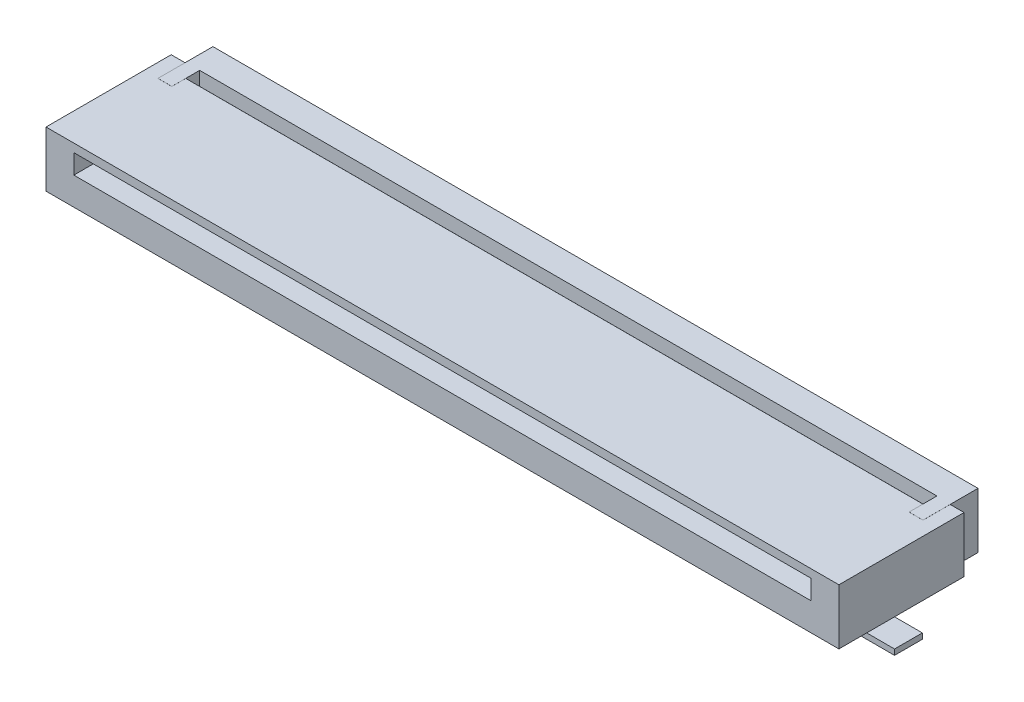
ISO-10303-21;
HEADER;
FILE_DESCRIPTION(('STEP AP214'),'2;1');
FILE_NAME('part.step','',(''),(''),'','','');
FILE_SCHEMA(('AUTOMOTIVE_DESIGN { 1 0 10303 214 1 1 1 1 }'));
ENDSEC;
DATA;
#1=APPLICATION_CONTEXT('core data for automotive mechanical design processes');
#2=APPLICATION_PROTOCOL_DEFINITION('international standard','automotive_design',2000,#1);
#3=PRODUCT_CONTEXT('',#1,'mechanical');
#4=PRODUCT('Part','Part','',(#3));
#5=PRODUCT_RELATED_PRODUCT_CATEGORY('part','',(#4));
#6=PRODUCT_DEFINITION_FORMATION('','',#4);
#7=PRODUCT_DEFINITION_CONTEXT('part definition',#1,'design');
#8=PRODUCT_DEFINITION('design','',#6,#7);
#9=PRODUCT_DEFINITION_SHAPE('','',#8);
#10=(LENGTH_UNIT() NAMED_UNIT(*) SI_UNIT(.MILLI.,.METRE.));
#11=(NAMED_UNIT(*) PLANE_ANGLE_UNIT() SI_UNIT($,.RADIAN.));
#12=(NAMED_UNIT(*) SI_UNIT($,.STERADIAN.) SOLID_ANGLE_UNIT());
#13=UNCERTAINTY_MEASURE_WITH_UNIT(LENGTH_MEASURE(1.E-05),#10,'distance_accuracy_value','');
#14=(GEOMETRIC_REPRESENTATION_CONTEXT(3) GLOBAL_UNCERTAINTY_ASSIGNED_CONTEXT((#13)) GLOBAL_UNIT_ASSIGNED_CONTEXT((#10,
#11,#12)) REPRESENTATION_CONTEXT('',''));
#15=CARTESIAN_POINT('',(0.,0.,0.));
#16=DIRECTION('',(0.,0.,1.));
#17=DIRECTION('',(1.,0.,0.));
#18=AXIS2_PLACEMENT_3D('',#15,#16,#17);
#19=CARTESIAN_POINT('',(14.25,2.,2.75));
#20=DIRECTION('',(-1.,0.,0.));
#21=DIRECTION('',(0.,0.,1.));
#22=AXIS2_PLACEMENT_3D('',#19,#20,#21);
#23=PLANE('',#22);
#24=DIRECTION('',(0.,0.,-1.));
#25=VECTOR('',#24,1.);
#26=CARTESIAN_POINT('',(14.25,1.998,-1.75));
#27=LINE('',#26,#25);
#28=CARTESIAN_POINT('',(14.25,1.998,2.75));
#29=VERTEX_POINT('',#28);
#30=CARTESIAN_POINT('',(14.25,1.998,-1.75));
#31=VERTEX_POINT('',#30);
#32=EDGE_CURVE('E299',#29,#31,#27,.T.);
#33=ORIENTED_EDGE('',*,*,#32,.F.);
#34=DIRECTION('',(0.,-1.,0.));
#35=VECTOR('',#34,1.);
#36=CARTESIAN_POINT('',(14.25,2.,2.75));
#37=LINE('',#36,#35);
#38=CARTESIAN_POINT('',(14.25,0.,2.75));
#39=VERTEX_POINT('',#38);
#40=EDGE_CURVE('E499',#29,#39,#37,.T.);
#41=ORIENTED_EDGE('',*,*,#40,.T.);
#42=DIRECTION('',(0.,0.,-1.));
#43=VECTOR('',#42,1.);
#44=CARTESIAN_POINT('',(14.25,0.,2.75));
#45=LINE('',#44,#43);
#46=CARTESIAN_POINT('',(14.25,0.,1.75));
#47=VERTEX_POINT('',#46);
#48=EDGE_CURVE('E501',#39,#47,#45,.T.);
#49=ORIENTED_EDGE('',*,*,#48,.T.);
#50=CARTESIAN_POINT('',(14.25,0.,0.749999999999999));
#51=VERTEX_POINT('',#50);
#52=EDGE_CURVE('E505',#47,#51,#45,.T.);
#53=ORIENTED_EDGE('',*,*,#52,.T.);
#54=CARTESIAN_POINT('',(14.25,0.,-1.75));
#55=VERTEX_POINT('',#54);
#56=EDGE_CURVE('E491',#51,#55,#45,.T.);
#57=ORIENTED_EDGE('',*,*,#56,.T.);
#58=DIRECTION('',(0.,1.,0.));
#59=VECTOR('',#58,1.);
#60=CARTESIAN_POINT('',(14.25,0.,-1.75));
#61=LINE('',#60,#59);
#62=EDGE_CURVE('E471',#55,#31,#61,.T.);
#63=ORIENTED_EDGE('',*,*,#62,.T.);
#64=EDGE_LOOP('',(#33,#41,#49,#53,#57,#63));
#65=FACE_BOUND('',#64,.T.);
#66=ADVANCED_FACE('F36',(#65),#23,.F.);
#67=CARTESIAN_POINT('',(-14.25,2.,2.75));
#68=DIRECTION('',(1.,0.,0.));
#69=DIRECTION('',(0.,0.,-1.));
#70=AXIS2_PLACEMENT_3D('',#67,#68,#69);
#71=PLANE('',#70);
#72=DIRECTION('',(0.,0.,1.));
#73=VECTOR('',#72,1.);
#74=CARTESIAN_POINT('',(-14.25,1.998,-1.75));
#75=LINE('',#74,#73);
#76=CARTESIAN_POINT('',(-14.25,1.998,-1.75));
#77=VERTEX_POINT('',#76);
#78=CARTESIAN_POINT('',(-14.25,1.998,2.75));
#79=VERTEX_POINT('',#78);
#80=EDGE_CURVE('E294',#77,#79,#75,.T.);
#81=ORIENTED_EDGE('',*,*,#80,.F.);
#82=DIRECTION('',(0.,1.,0.));
#83=VECTOR('',#82,1.);
#84=CARTESIAN_POINT('',(-14.25,0.,-1.75));
#85=LINE('',#84,#83);
#86=CARTESIAN_POINT('',(-14.25,0.,-1.75));
#87=VERTEX_POINT('',#86);
#88=EDGE_CURVE('E485',#87,#77,#85,.T.);
#89=ORIENTED_EDGE('',*,*,#88,.F.);
#90=DIRECTION('',(0.,0.,1.));
#91=VECTOR('',#90,1.);
#92=CARTESIAN_POINT('',(-14.25,0.,2.75));
#93=LINE('',#92,#91);
#94=CARTESIAN_POINT('',(-14.25,0.,0.749999999999999));
#95=VERTEX_POINT('',#94);
#96=EDGE_CURVE('E508',#87,#95,#93,.T.);
#97=ORIENTED_EDGE('',*,*,#96,.T.);
#98=CARTESIAN_POINT('',(-14.25,0.,1.75));
#99=VERTEX_POINT('',#98);
#100=EDGE_CURVE('E511',#95,#99,#93,.T.);
#101=ORIENTED_EDGE('',*,*,#100,.T.);
#102=CARTESIAN_POINT('',(-14.25,0.,2.75));
#103=VERTEX_POINT('',#102);
#104=EDGE_CURVE('E507',#99,#103,#93,.T.);
#105=ORIENTED_EDGE('',*,*,#104,.T.);
#106=DIRECTION('',(0.,-1.,0.));
#107=VECTOR('',#106,1.);
#108=CARTESIAN_POINT('',(-14.25,2.,2.75));
#109=LINE('',#108,#107);
#110=EDGE_CURVE('E515',#79,#103,#109,.T.);
#111=ORIENTED_EDGE('',*,*,#110,.F.);
#112=EDGE_LOOP('',(#81,#89,#97,#101,#105,#111));
#113=FACE_BOUND('',#112,.T.);
#114=ADVANCED_FACE('F548',(#113),#71,.F.);
#115=CARTESIAN_POINT('',(-14.25,2.,2.75));
#116=DIRECTION('',(0.,0.,-1.));
#117=DIRECTION('',(-1.,0.,0.));
#118=AXIS2_PLACEMENT_3D('',#115,#116,#117);
#119=PLANE('',#118);
#120=DIRECTION('',(1.,0.,0.));
#121=VECTOR('',#120,1.);
#122=CARTESIAN_POINT('',(-13.25,1.,2.75));
#123=LINE('',#122,#121);
#124=CARTESIAN_POINT('',(-13.25,1.,2.75));
#125=VERTEX_POINT('',#124);
#126=CARTESIAN_POINT('',(13.25,1.,2.75));
#127=VERTEX_POINT('',#126);
#128=EDGE_CURVE('E350',#125,#127,#123,.T.);
#129=ORIENTED_EDGE('',*,*,#128,.F.);
#130=DIRECTION('',(0.,-1.,0.));
#131=VECTOR('',#130,1.);
#132=CARTESIAN_POINT('',(-13.25,1.7,2.75));
#133=LINE('',#132,#131);
#134=CARTESIAN_POINT('',(-13.25,1.7,2.75));
#135=VERTEX_POINT('',#134);
#136=EDGE_CURVE('E333',#135,#125,#133,.T.);
#137=ORIENTED_EDGE('',*,*,#136,.F.);
#138=DIRECTION('',(-1.,0.,0.));
#139=VECTOR('',#138,1.);
#140=CARTESIAN_POINT('',(-13.25,1.7,2.75));
#141=LINE('',#140,#139);
#142=CARTESIAN_POINT('',(13.25,1.7,2.75));
#143=VERTEX_POINT('',#142);
#144=EDGE_CURVE('E343',#143,#135,#141,.T.);
#145=ORIENTED_EDGE('',*,*,#144,.F.);
#146=DIRECTION('',(0.,1.,0.));
#147=VECTOR('',#146,1.);
#148=CARTESIAN_POINT('',(13.25,1.7,2.75));
#149=LINE('',#148,#147);
#150=EDGE_CURVE('E353',#127,#143,#149,.T.);
#151=ORIENTED_EDGE('',*,*,#150,.F.);
#152=EDGE_LOOP('',(#129,#137,#145,#151));
#153=FACE_BOUND('',#152,.T.);
#154=DIRECTION('',(1.,0.,0.));
#155=VECTOR('',#154,1.);
#156=CARTESIAN_POINT('',(-14.25,1.998,2.75));
#157=LINE('',#156,#155);
#158=EDGE_CURVE('E297',#79,#29,#157,.T.);
#159=ORIENTED_EDGE('',*,*,#158,.F.);
#160=ORIENTED_EDGE('',*,*,#110,.T.);
#161=DIRECTION('',(1.,0.,0.));
#162=VECTOR('',#161,1.);
#163=CARTESIAN_POINT('',(-14.25,0.,2.75));
#164=LINE('',#163,#162);
#165=EDGE_CURVE('E500',#103,#39,#164,.T.);
#166=ORIENTED_EDGE('',*,*,#165,.T.);
#167=ORIENTED_EDGE('',*,*,#40,.F.);
#168=EDGE_LOOP('',(#159,#160,#166,#167));
#169=FACE_BOUND('',#168,.T.);
#170=ADVANCED_FACE('F554',(#153,#169),#119,.F.);
#171=CARTESIAN_POINT('',(-14.25,0.,-1.75));
#172=DIRECTION('',(0.,0.,1.));
#173=DIRECTION('',(1.,0.,0.));
#174=AXIS2_PLACEMENT_3D('',#171,#172,#173);
#175=PLANE('',#174);
#176=DIRECTION('',(-1.,0.,0.));
#177=VECTOR('',#176,1.);
#178=CARTESIAN_POINT('',(-13.75,1.998,-1.75));
#179=LINE('',#178,#177);
#180=CARTESIAN_POINT('',(-13.75,1.998,-1.75));
#181=VERTEX_POINT('',#180);
#182=EDGE_CURVE('E292',#181,#77,#179,.T.);
#183=ORIENTED_EDGE('',*,*,#182,.F.);
#184=DIRECTION('',(0.,1.,0.));
#185=VECTOR('',#184,1.);
#186=CARTESIAN_POINT('',(-13.75,0.,-1.75));
#187=LINE('',#186,#185);
#188=CARTESIAN_POINT('',(-13.75,0.,-1.75));
#189=VERTEX_POINT('',#188);
#190=EDGE_CURVE('E492',#189,#181,#187,.T.);
#191=ORIENTED_EDGE('',*,*,#190,.F.);
#192=DIRECTION('',(1.,0.,0.));
#193=VECTOR('',#192,1.);
#194=CARTESIAN_POINT('',(-14.25,0.,-1.75));
#195=LINE('',#194,#193);
#196=EDGE_CURVE('E479',#87,#189,#195,.T.);
#197=ORIENTED_EDGE('',*,*,#196,.F.);
#198=ORIENTED_EDGE('',*,*,#88,.T.);
#199=EDGE_LOOP('',(#183,#191,#197,#198));
#200=FACE_BOUND('',#199,.T.);
#201=ADVANCED_FACE('F625',(#200),#175,.F.);
#202=CARTESIAN_POINT('',(14.25,0.,-1.75));
#203=DIRECTION('',(0.,0.,1.));
#204=DIRECTION('',(1.,0.,0.));
#205=AXIS2_PLACEMENT_3D('',#202,#203,#204);
#206=PLANE('',#205);
#207=DIRECTION('',(-1.,0.,0.));
#208=VECTOR('',#207,1.);
#209=CARTESIAN_POINT('',(13.75,1.998,-1.75));
#210=LINE('',#209,#208);
#211=CARTESIAN_POINT('',(13.75,1.998,-1.75));
#212=VERTEX_POINT('',#211);
#213=EDGE_CURVE('E57',#31,#212,#210,.T.);
#214=ORIENTED_EDGE('',*,*,#213,.F.);
#215=ORIENTED_EDGE('',*,*,#62,.F.);
#216=DIRECTION('',(1.,0.,0.));
#217=VECTOR('',#216,1.);
#218=CARTESIAN_POINT('',(14.25,0.,-1.75));
#219=LINE('',#218,#217);
#220=CARTESIAN_POINT('',(13.75,0.,-1.75));
#221=VERTEX_POINT('',#220);
#222=EDGE_CURVE('E466',#221,#55,#219,.T.);
#223=ORIENTED_EDGE('',*,*,#222,.F.);
#224=DIRECTION('',(0.,1.,0.));
#225=VECTOR('',#224,1.);
#226=CARTESIAN_POINT('',(13.75,0.,-1.75));
#227=LINE('',#226,#225);
#228=EDGE_CURVE('E475',#221,#212,#227,.T.);
#229=ORIENTED_EDGE('',*,*,#228,.T.);
#230=EDGE_LOOP('',(#214,#215,#223,#229));
#231=FACE_BOUND('',#230,.T.);
#232=ADVANCED_FACE('F562',(#231),#206,.F.);
#233=CARTESIAN_POINT('',(0.,0.,0.));
#234=DIRECTION('',(0.,-1.,0.));
#235=DIRECTION('',(0.,0.,-1.));
#236=AXIS2_PLACEMENT_3D('',#233,#234,#235);
#237=PLANE('',#236);
#238=DIRECTION('',(0.,0.,-1.));
#239=VECTOR('',#238,1.);
#240=CARTESIAN_POINT('',(13.25,0.,1.75));
#241=LINE('',#240,#239);
#242=CARTESIAN_POINT('',(13.25,0.,1.75));
#243=VERTEX_POINT('',#242);
#244=CARTESIAN_POINT('',(13.25,0.,0.749999999999999));
#245=VERTEX_POINT('',#244);
#246=EDGE_CURVE('E409',#243,#245,#241,.T.);
#247=ORIENTED_EDGE('',*,*,#246,.F.);
#248=DIRECTION('',(1.,0.,0.));
#249=VECTOR('',#248,1.);
#250=CARTESIAN_POINT('',(0.,0.,1.75));
#251=LINE('',#250,#249);
#252=EDGE_CURVE('E43',#243,#47,#251,.T.);
#253=ORIENTED_EDGE('',*,*,#252,.T.);
#254=ORIENTED_EDGE('',*,*,#48,.F.);
#255=ORIENTED_EDGE('',*,*,#165,.F.);
#256=ORIENTED_EDGE('',*,*,#104,.F.);
#257=DIRECTION('',(-1.,0.,0.));
#258=VECTOR('',#257,1.);
#259=CARTESIAN_POINT('',(-15.25,0.,1.75));
#260=LINE('',#259,#258);
#261=CARTESIAN_POINT('',(-13.25,0.,1.75));
#262=VERTEX_POINT('',#261);
#263=EDGE_CURVE('E432',#262,#99,#260,.T.);
#264=ORIENTED_EDGE('',*,*,#263,.F.);
#265=DIRECTION('',(0.,0.,1.));
#266=VECTOR('',#265,1.);
#267=CARTESIAN_POINT('',(-13.25,0.,1.75));
#268=LINE('',#267,#266);
#269=CARTESIAN_POINT('',(-13.25,0.,0.749999999999999));
#270=VERTEX_POINT('',#269);
#271=EDGE_CURVE('E444',#270,#262,#268,.T.);
#272=ORIENTED_EDGE('',*,*,#271,.F.);
#273=DIRECTION('',(1.,0.,0.));
#274=VECTOR('',#273,1.);
#275=CARTESIAN_POINT('',(-15.25,0.,0.749999999999999));
#276=LINE('',#275,#274);
#277=EDGE_CURVE('E445',#95,#270,#276,.T.);
#278=ORIENTED_EDGE('',*,*,#277,.F.);
#279=ORIENTED_EDGE('',*,*,#96,.F.);
#280=ORIENTED_EDGE('',*,*,#196,.T.);
#281=DIRECTION('',(0.,0.,-1.));
#282=VECTOR('',#281,1.);
#283=CARTESIAN_POINT('',(-13.75,0.,-2.75));
#284=LINE('',#283,#282);
#285=CARTESIAN_POINT('',(-13.75,0.,-2.75));
#286=VERTEX_POINT('',#285);
#287=EDGE_CURVE('E482',#189,#286,#284,.T.);
#288=ORIENTED_EDGE('',*,*,#287,.T.);
#289=DIRECTION('',(-1.,0.,0.));
#290=VECTOR('',#289,1.);
#291=CARTESIAN_POINT('',(-14.25,0.,-2.75));
#292=LINE('',#291,#290);
#293=CARTESIAN_POINT('',(13.75,0.,-2.75));
#294=VERTEX_POINT('',#293);
#295=EDGE_CURVE('E504',#294,#286,#292,.T.);
#296=ORIENTED_EDGE('',*,*,#295,.F.);
#297=DIRECTION('',(0.,0.,1.));
#298=VECTOR('',#297,1.);
#299=CARTESIAN_POINT('',(13.75,0.,-2.75));
#300=LINE('',#299,#298);
#301=EDGE_CURVE('E463',#294,#221,#300,.T.);
#302=ORIENTED_EDGE('',*,*,#301,.T.);
#303=ORIENTED_EDGE('',*,*,#222,.T.);
#304=ORIENTED_EDGE('',*,*,#56,.F.);
#305=DIRECTION('',(1.,0.,0.));
#306=VECTOR('',#305,1.);
#307=CARTESIAN_POINT('',(15.25,0.,0.749999999999999));
#308=LINE('',#307,#306);
#309=EDGE_CURVE('E413',#245,#51,#308,.T.);
#310=ORIENTED_EDGE('',*,*,#309,.F.);
#311=EDGE_LOOP('',(#247,#253,#254,#255,#256,#264,#272,#278,#279,#280,#288,#296,#302,#303,#304,#310));
#312=FACE_BOUND('',#311,.T.);
#313=DIRECTION('',(-1.,0.,0.));
#314=VECTOR('',#313,1.);
#315=CARTESIAN_POINT('',(13.25,0.,-2.35));
#316=LINE('',#315,#314);
#317=CARTESIAN_POINT('',(13.25,0.,-2.35));
#318=VERTEX_POINT('',#317);
#319=CARTESIAN_POINT('',(-13.25,0.,-2.35));
#320=VERTEX_POINT('',#319);
#321=EDGE_CURVE('E380',#318,#320,#316,.T.);
#322=ORIENTED_EDGE('',*,*,#321,.F.);
#323=DIRECTION('',(0.,0.,1.));
#324=VECTOR('',#323,1.);
#325=CARTESIAN_POINT('',(13.25,0.,-2.55));
#326=LINE('',#325,#324);
#327=CARTESIAN_POINT('',(13.25,0.,-2.55));
#328=VERTEX_POINT('',#327);
#329=EDGE_CURVE('E360',#328,#318,#326,.T.);
#330=ORIENTED_EDGE('',*,*,#329,.F.);
#331=DIRECTION('',(1.,0.,0.));
#332=VECTOR('',#331,1.);
#333=CARTESIAN_POINT('',(13.25,0.,-2.55));
#334=LINE('',#333,#332);
#335=CARTESIAN_POINT('',(-13.25,0.,-2.55));
#336=VERTEX_POINT('',#335);
#337=EDGE_CURVE('E371',#336,#328,#334,.T.);
#338=ORIENTED_EDGE('',*,*,#337,.F.);
#339=DIRECTION('',(0.,0.,-1.));
#340=VECTOR('',#339,1.);
#341=CARTESIAN_POINT('',(-13.25,0.,-2.55));
#342=LINE('',#341,#340);
#343=EDGE_CURVE('E382',#320,#336,#342,.T.);
#344=ORIENTED_EDGE('',*,*,#343,.F.);
#345=EDGE_LOOP('',(#322,#330,#338,#344));
#346=FACE_BOUND('',#345,.T.);
#347=ADVANCED_FACE('F549',(#312,#346),#237,.T.);
#348=CARTESIAN_POINT('',(-14.25,2.,-2.75));
#349=DIRECTION('',(0.,0.,1.));
#350=DIRECTION('',(1.,0.,0.));
#351=AXIS2_PLACEMENT_3D('',#348,#349,#350);
#352=PLANE('',#351);
#353=DIRECTION('',(-1.,0.,0.));
#354=VECTOR('',#353,1.);
#355=CARTESIAN_POINT('',(-14.25,2.,-2.75));
#356=LINE('',#355,#354);
#357=CARTESIAN_POINT('',(13.75,2.,-2.75));
#358=VERTEX_POINT('',#357);
#359=CARTESIAN_POINT('',(-13.75,2.,-2.75));
#360=VERTEX_POINT('',#359);
#361=EDGE_CURVE('E497',#358,#360,#356,.T.);
#362=ORIENTED_EDGE('',*,*,#361,.F.);
#363=DIRECTION('',(0.,1.,0.));
#364=VECTOR('',#363,1.);
#365=CARTESIAN_POINT('',(13.75,0.,-2.75));
#366=LINE('',#365,#364);
#367=EDGE_CURVE('E469',#294,#358,#366,.T.);
#368=ORIENTED_EDGE('',*,*,#367,.F.);
#369=ORIENTED_EDGE('',*,*,#295,.T.);
#370=DIRECTION('',(0.,1.,0.));
#371=VECTOR('',#370,1.);
#372=CARTESIAN_POINT('',(-13.75,0.,-2.75));
#373=LINE('',#372,#371);
#374=EDGE_CURVE('E488',#286,#360,#373,.T.);
#375=ORIENTED_EDGE('',*,*,#374,.T.);
#376=EDGE_LOOP('',(#362,#368,#369,#375));
#377=FACE_BOUND('',#376,.T.);
#378=ADVANCED_FACE('F572',(#377),#352,.F.);
#379=CARTESIAN_POINT('',(0.,2.,0.));
#380=DIRECTION('',(0.,-1.,0.));
#381=DIRECTION('',(0.,0.,-1.));
#382=AXIS2_PLACEMENT_3D('',#379,#380,#381);
#383=PLANE('',#382);
#384=DIRECTION('',(0.,0.,1.));
#385=VECTOR('',#384,1.);
#386=CARTESIAN_POINT('',(-13.25,2.,-0.773341088289437));
#387=LINE('',#386,#385);
#388=CARTESIAN_POINT('',(-13.25,2.,-1.77334108828944));
#389=VERTEX_POINT('',#388);
#390=CARTESIAN_POINT('',(-13.25,2.,-0.773341088289437));
#391=VERTEX_POINT('',#390);
#392=EDGE_CURVE('E325',#389,#391,#387,.T.);
#393=ORIENTED_EDGE('',*,*,#392,.F.);
#394=DIRECTION('',(-1.,0.,0.));
#395=VECTOR('',#394,1.);
#396=CARTESIAN_POINT('',(-13.25,2.,-1.77334108828944));
#397=LINE('',#396,#395);
#398=CARTESIAN_POINT('',(13.25,2.,-1.77334108828944));
#399=VERTEX_POINT('',#398);
#400=EDGE_CURVE('E283',#399,#389,#397,.T.);
#401=ORIENTED_EDGE('',*,*,#400,.F.);
#402=DIRECTION('',(0.,0.,-1.));
#403=VECTOR('',#402,1.);
#404=CARTESIAN_POINT('',(13.25,2.,-0.773341088289437));
#405=LINE('',#404,#403);
#406=CARTESIAN_POINT('',(13.25,2.,-0.773341088289437));
#407=VERTEX_POINT('',#406);
#408=EDGE_CURVE('E269',#407,#399,#405,.T.);
#409=ORIENTED_EDGE('',*,*,#408,.F.);
#410=DIRECTION('',(-1.,0.,0.));
#411=VECTOR('',#410,1.);
#412=CARTESIAN_POINT('',(13.75,2.,-0.773341088289437));
#413=LINE('',#412,#411);
#414=CARTESIAN_POINT('',(13.75,2.,-0.773341088289437));
#415=VERTEX_POINT('',#414);
#416=EDGE_CURVE('E291',#415,#407,#413,.T.);
#417=ORIENTED_EDGE('',*,*,#416,.F.);
#418=DIRECTION('',(0.,0.,1.));
#419=VECTOR('',#418,1.);
#420=CARTESIAN_POINT('',(13.75,2.,-2.75));
#421=LINE('',#420,#419);
#422=EDGE_CURVE('E462',#358,#415,#421,.T.);
#423=ORIENTED_EDGE('',*,*,#422,.F.);
#424=ORIENTED_EDGE('',*,*,#361,.T.);
#425=DIRECTION('',(0.,0.,-1.));
#426=VECTOR('',#425,1.);
#427=CARTESIAN_POINT('',(-13.75,2.,-2.75));
#428=LINE('',#427,#426);
#429=CARTESIAN_POINT('',(-13.75,2.,-0.773341088289437));
#430=VERTEX_POINT('',#429);
#431=EDGE_CURVE('E474',#430,#360,#428,.T.);
#432=ORIENTED_EDGE('',*,*,#431,.F.);
#433=DIRECTION('',(-1.,0.,0.));
#434=VECTOR('',#433,1.);
#435=CARTESIAN_POINT('',(-13.75,2.,-0.773341088289437));
#436=LINE('',#435,#434);
#437=EDGE_CURVE('E295',#391,#430,#436,.T.);
#438=ORIENTED_EDGE('',*,*,#437,.F.);
#439=EDGE_LOOP('',(#393,#401,#409,#417,#423,#424,#432,#438));
#440=FACE_BOUND('',#439,.T.);
#441=ADVANCED_FACE('F575',(#440),#383,.F.);
#442=CARTESIAN_POINT('',(-13.75,0.,-2.75));
#443=DIRECTION('',(1.,0.,0.));
#444=DIRECTION('',(0.,0.,-1.));
#445=AXIS2_PLACEMENT_3D('',#442,#443,#444);
#446=PLANE('',#445);
#447=ORIENTED_EDGE('',*,*,#431,.T.);
#448=ORIENTED_EDGE('',*,*,#374,.F.);
#449=ORIENTED_EDGE('',*,*,#287,.F.);
#450=ORIENTED_EDGE('',*,*,#190,.T.);
#451=DIRECTION('',(0.,0.,-1.));
#452=VECTOR('',#451,1.);
#453=CARTESIAN_POINT('',(-13.75,1.998,-1.75));
#454=LINE('',#453,#452);
#455=CARTESIAN_POINT('',(-13.75,1.998,-0.773341088289437));
#456=VERTEX_POINT('',#455);
#457=EDGE_CURVE('E319',#456,#181,#454,.T.);
#458=ORIENTED_EDGE('',*,*,#457,.F.);
#459=DIRECTION('',(0.,1.,0.));
#460=VECTOR('',#459,1.);
#461=CARTESIAN_POINT('',(-13.75,1.998,-0.773341088289437));
#462=LINE('',#461,#460);
#463=EDGE_CURVE('E330',#456,#430,#462,.T.);
#464=ORIENTED_EDGE('',*,*,#463,.T.);
#465=EDGE_LOOP('',(#447,#448,#449,#450,#458,#464));
#466=FACE_BOUND('',#465,.T.);
#467=ADVANCED_FACE('F579',(#466),#446,.F.);
#468=CARTESIAN_POINT('',(13.75,0.,-2.75));
#469=DIRECTION('',(-1.,0.,0.));
#470=DIRECTION('',(0.,0.,1.));
#471=AXIS2_PLACEMENT_3D('',#468,#469,#470);
#472=PLANE('',#471);
#473=ORIENTED_EDGE('',*,*,#422,.T.);
#474=DIRECTION('',(0.,1.,0.));
#475=VECTOR('',#474,1.);
#476=CARTESIAN_POINT('',(13.75,1.998,-0.773341088289437));
#477=LINE('',#476,#475);
#478=CARTESIAN_POINT('',(13.75,1.998,-0.773341088289437));
#479=VERTEX_POINT('',#478);
#480=EDGE_CURVE('E321',#479,#415,#477,.T.);
#481=ORIENTED_EDGE('',*,*,#480,.F.);
#482=DIRECTION('',(0.,0.,1.));
#483=VECTOR('',#482,1.);
#484=CARTESIAN_POINT('',(13.75,1.998,-1.75));
#485=LINE('',#484,#483);
#486=EDGE_CURVE('E302',#212,#479,#485,.T.);
#487=ORIENTED_EDGE('',*,*,#486,.F.);
#488=ORIENTED_EDGE('',*,*,#228,.F.);
#489=ORIENTED_EDGE('',*,*,#301,.F.);
#490=ORIENTED_EDGE('',*,*,#367,.T.);
#491=EDGE_LOOP('',(#473,#481,#487,#488,#489,#490));
#492=FACE_BOUND('',#491,.T.);
#493=ADVANCED_FACE('F568',(#492),#472,.F.);
#494=CARTESIAN_POINT('',(-15.25,-0.2,1.75));
#495=DIRECTION('',(1.,0.,0.));
#496=DIRECTION('',(0.,0.,-1.));
#497=AXIS2_PLACEMENT_3D('',#494,#495,#496);
#498=PLANE('',#497);
#499=DIRECTION('',(0.,0.,-1.));
#500=VECTOR('',#499,1.);
#501=CARTESIAN_POINT('',(-15.25,0.,1.75));
#502=LINE('',#501,#500);
#503=CARTESIAN_POINT('',(-15.25,0.,1.75));
#504=VERTEX_POINT('',#503);
#505=CARTESIAN_POINT('',(-15.25,0.,0.749999999999999));
#506=VERTEX_POINT('',#505);
#507=EDGE_CURVE('E427',#504,#506,#502,.T.);
#508=ORIENTED_EDGE('',*,*,#507,.T.);
#509=DIRECTION('',(0.,1.,0.));
#510=VECTOR('',#509,1.);
#511=CARTESIAN_POINT('',(-15.25,-0.2,0.749999999999999));
#512=LINE('',#511,#510);
#513=CARTESIAN_POINT('',(-15.25,-0.2,0.749999999999999));
#514=VERTEX_POINT('',#513);
#515=EDGE_CURVE('E459',#514,#506,#512,.T.);
#516=ORIENTED_EDGE('',*,*,#515,.F.);
#517=DIRECTION('',(0.,0.,-1.));
#518=VECTOR('',#517,1.);
#519=CARTESIAN_POINT('',(-15.25,-0.2,1.75));
#520=LINE('',#519,#518);
#521=CARTESIAN_POINT('',(-15.25,-0.2,1.75));
#522=VERTEX_POINT('',#521);
#523=EDGE_CURVE('E428',#522,#514,#520,.T.);
#524=ORIENTED_EDGE('',*,*,#523,.F.);
#525=DIRECTION('',(0.,1.,0.));
#526=VECTOR('',#525,1.);
#527=CARTESIAN_POINT('',(-15.25,-0.2,1.75));
#528=LINE('',#527,#526);
#529=EDGE_CURVE('E438',#522,#504,#528,.T.);
#530=ORIENTED_EDGE('',*,*,#529,.T.);
#531=EDGE_LOOP('',(#508,#516,#524,#530));
#532=FACE_BOUND('',#531,.T.);
#533=ADVANCED_FACE('F537',(#532),#498,.F.);
#534=CARTESIAN_POINT('',(-15.25,-0.2,0.749999999999999));
#535=DIRECTION('',(0.,0.,1.));
#536=DIRECTION('',(1.,0.,0.));
#537=AXIS2_PLACEMENT_3D('',#534,#535,#536);
#538=PLANE('',#537);
#539=EDGE_CURVE('E441',#506,#95,#276,.T.);
#540=ORIENTED_EDGE('',*,*,#539,.T.);
#541=ORIENTED_EDGE('',*,*,#277,.T.);
#542=DIRECTION('',(0.,1.,0.));
#543=VECTOR('',#542,1.);
#544=CARTESIAN_POINT('',(-13.25,-0.2,0.749999999999999));
#545=LINE('',#544,#543);
#546=CARTESIAN_POINT('',(-13.25,-0.2,0.749999999999999));
#547=VERTEX_POINT('',#546);
#548=EDGE_CURVE('E456',#547,#270,#545,.T.);
#549=ORIENTED_EDGE('',*,*,#548,.F.);
#550=DIRECTION('',(1.,0.,0.));
#551=VECTOR('',#550,1.);
#552=CARTESIAN_POINT('',(-15.25,-0.2,0.749999999999999));
#553=LINE('',#552,#551);
#554=EDGE_CURVE('E431',#514,#547,#553,.T.);
#555=ORIENTED_EDGE('',*,*,#554,.F.);
#556=ORIENTED_EDGE('',*,*,#515,.T.);
#557=EDGE_LOOP('',(#540,#541,#549,#555,#556));
#558=FACE_BOUND('',#557,.T.);
#559=ADVANCED_FACE('F523',(#558),#538,.F.);
#560=CARTESIAN_POINT('',(-13.25,-0.2,1.75));
#561=DIRECTION('',(-1.,0.,0.));
#562=DIRECTION('',(0.,0.,1.));
#563=AXIS2_PLACEMENT_3D('',#560,#561,#562);
#564=PLANE('',#563);
#565=ORIENTED_EDGE('',*,*,#271,.T.);
#566=DIRECTION('',(0.,1.,0.));
#567=VECTOR('',#566,1.);
#568=CARTESIAN_POINT('',(-13.25,-0.2,1.75));
#569=LINE('',#568,#567);
#570=CARTESIAN_POINT('',(-13.25,-0.2,1.75));
#571=VERTEX_POINT('',#570);
#572=EDGE_CURVE('E453',#571,#262,#569,.T.);
#573=ORIENTED_EDGE('',*,*,#572,.F.);
#574=DIRECTION('',(0.,0.,1.));
#575=VECTOR('',#574,1.);
#576=CARTESIAN_POINT('',(-13.25,-0.2,1.75));
#577=LINE('',#576,#575);
#578=EDGE_CURVE('E434',#547,#571,#577,.T.);
#579=ORIENTED_EDGE('',*,*,#578,.F.);
#580=ORIENTED_EDGE('',*,*,#548,.T.);
#581=EDGE_LOOP('',(#565,#573,#579,#580));
#582=FACE_BOUND('',#581,.T.);
#583=ADVANCED_FACE('F527',(#582),#564,.F.);
#584=CARTESIAN_POINT('',(-15.25,-0.2,1.75));
#585=DIRECTION('',(0.,0.,-1.));
#586=DIRECTION('',(-1.,0.,0.));
#587=AXIS2_PLACEMENT_3D('',#584,#585,#586);
#588=PLANE('',#587);
#589=ORIENTED_EDGE('',*,*,#263,.T.);
#590=EDGE_CURVE('E448',#99,#504,#260,.T.);
#591=ORIENTED_EDGE('',*,*,#590,.T.);
#592=ORIENTED_EDGE('',*,*,#529,.F.);
#593=DIRECTION('',(-1.,0.,0.));
#594=VECTOR('',#593,1.);
#595=CARTESIAN_POINT('',(-15.25,-0.2,1.75));
#596=LINE('',#595,#594);
#597=EDGE_CURVE('E436',#571,#522,#596,.T.);
#598=ORIENTED_EDGE('',*,*,#597,.F.);
#599=ORIENTED_EDGE('',*,*,#572,.T.);
#600=EDGE_LOOP('',(#589,#591,#592,#598,#599));
#601=FACE_BOUND('',#600,.T.);
#602=ADVANCED_FACE('F652',(#601),#588,.F.);
#603=CARTESIAN_POINT('',(0.,-0.2,0.));
#604=DIRECTION('',(0.,-1.,0.));
#605=DIRECTION('',(0.,0.,-1.));
#606=AXIS2_PLACEMENT_3D('',#603,#604,#605);
#607=PLANE('',#606);
#608=ORIENTED_EDGE('',*,*,#523,.T.);
#609=ORIENTED_EDGE('',*,*,#554,.T.);
#610=ORIENTED_EDGE('',*,*,#578,.T.);
#611=ORIENTED_EDGE('',*,*,#597,.T.);
#612=EDGE_LOOP('',(#608,#609,#610,#611));
#613=FACE_BOUND('',#612,.T.);
#614=ADVANCED_FACE('F531',(#613),#607,.T.);
#615=CARTESIAN_POINT('',(0.,0.,0.));
#616=DIRECTION('',(0.,-1.,0.));
#617=DIRECTION('',(0.,0.,-1.));
#618=AXIS2_PLACEMENT_3D('',#615,#616,#617);
#619=PLANE('',#618);
#620=ORIENTED_EDGE('',*,*,#100,.F.);
#621=ORIENTED_EDGE('',*,*,#539,.F.);
#622=ORIENTED_EDGE('',*,*,#507,.F.);
#623=ORIENTED_EDGE('',*,*,#590,.F.);
#624=EDGE_LOOP('',(#620,#621,#622,#623));
#625=FACE_BOUND('',#624,.T.);
#626=ADVANCED_FACE('F541',(#625),#619,.F.);
#627=CARTESIAN_POINT('',(0.,0.,0.));
#628=DIRECTION('',(0.,-1.,0.));
#629=DIRECTION('',(0.,0.,-1.));
#630=AXIS2_PLACEMENT_3D('',#627,#628,#629);
#631=PLANE('',#630);
#632=CARTESIAN_POINT('',(15.25,0.,0.749999999999999));
#633=VERTEX_POINT('',#632);
#634=EDGE_CURVE('E412',#51,#633,#308,.T.);
#635=ORIENTED_EDGE('',*,*,#634,.F.);
#636=ORIENTED_EDGE('',*,*,#52,.F.);
#637=DIRECTION('',(-1.,0.,0.));
#638=VECTOR('',#637,1.);
#639=CARTESIAN_POINT('',(15.25,0.,1.75));
#640=LINE('',#639,#638);
#641=CARTESIAN_POINT('',(15.25,0.,1.75));
#642=VERTEX_POINT('',#641);
#643=EDGE_CURVE('E395',#642,#47,#640,.T.);
#644=ORIENTED_EDGE('',*,*,#643,.F.);
#645=DIRECTION('',(0.,0.,1.));
#646=VECTOR('',#645,1.);
#647=CARTESIAN_POINT('',(15.25,0.,1.75));
#648=LINE('',#647,#646);
#649=EDGE_CURVE('E400',#633,#642,#648,.T.);
#650=ORIENTED_EDGE('',*,*,#649,.F.);
#651=EDGE_LOOP('',(#635,#636,#644,#650));
#652=FACE_BOUND('',#651,.T.);
#653=ADVANCED_FACE('F658',(#652),#631,.F.);
#654=CARTESIAN_POINT('',(15.25,-0.2,1.75));
#655=DIRECTION('',(0.,0.,-1.));
#656=DIRECTION('',(-1.,0.,0.));
#657=AXIS2_PLACEMENT_3D('',#654,#655,#656);
#658=PLANE('',#657);
#659=ORIENTED_EDGE('',*,*,#643,.T.);
#660=ORIENTED_EDGE('',*,*,#252,.F.);
#661=DIRECTION('',(0.,1.,0.));
#662=VECTOR('',#661,1.);
#663=CARTESIAN_POINT('',(13.25,-0.2,1.75));
#664=LINE('',#663,#662);
#665=CARTESIAN_POINT('',(13.25,-0.2,1.75));
#666=VERTEX_POINT('',#665);
#667=EDGE_CURVE('E424',#666,#243,#664,.T.);
#668=ORIENTED_EDGE('',*,*,#667,.F.);
#669=DIRECTION('',(-1.,0.,0.));
#670=VECTOR('',#669,1.);
#671=CARTESIAN_POINT('',(15.25,-0.2,1.75));
#672=LINE('',#671,#670);
#673=CARTESIAN_POINT('',(15.25,-0.2,1.75));
#674=VERTEX_POINT('',#673);
#675=EDGE_CURVE('E396',#674,#666,#672,.T.);
#676=ORIENTED_EDGE('',*,*,#675,.F.);
#677=DIRECTION('',(0.,1.,0.));
#678=VECTOR('',#677,1.);
#679=CARTESIAN_POINT('',(15.25,-0.2,1.75));
#680=LINE('',#679,#678);
#681=EDGE_CURVE('E406',#674,#642,#680,.T.);
#682=ORIENTED_EDGE('',*,*,#681,.T.);
#683=EDGE_LOOP('',(#659,#660,#668,#676,#682));
#684=FACE_BOUND('',#683,.T.);
#685=ADVANCED_FACE('F661',(#684),#658,.F.);
#686=CARTESIAN_POINT('',(13.25,-0.2,1.75));
#687=DIRECTION('',(1.,0.,0.));
#688=DIRECTION('',(0.,0.,-1.));
#689=AXIS2_PLACEMENT_3D('',#686,#687,#688);
#690=PLANE('',#689);
#691=ORIENTED_EDGE('',*,*,#246,.T.);
#692=DIRECTION('',(0.,1.,0.));
#693=VECTOR('',#692,1.);
#694=CARTESIAN_POINT('',(13.25,-0.2,0.749999999999999));
#695=LINE('',#694,#693);
#696=CARTESIAN_POINT('',(13.25,-0.2,0.749999999999999));
#697=VERTEX_POINT('',#696);
#698=EDGE_CURVE('E422',#697,#245,#695,.T.);
#699=ORIENTED_EDGE('',*,*,#698,.F.);
#700=DIRECTION('',(0.,0.,-1.));
#701=VECTOR('',#700,1.);
#702=CARTESIAN_POINT('',(13.25,-0.2,1.75));
#703=LINE('',#702,#701);
#704=EDGE_CURVE('E399',#666,#697,#703,.T.);
#705=ORIENTED_EDGE('',*,*,#704,.F.);
#706=ORIENTED_EDGE('',*,*,#667,.T.);
#707=EDGE_LOOP('',(#691,#699,#705,#706));
#708=FACE_BOUND('',#707,.T.);
#709=ADVANCED_FACE('F664',(#708),#690,.F.);
#710=CARTESIAN_POINT('',(15.25,-0.2,0.749999999999999));
#711=DIRECTION('',(0.,0.,1.));
#712=DIRECTION('',(1.,0.,0.));
#713=AXIS2_PLACEMENT_3D('',#710,#711,#712);
#714=PLANE('',#713);
#715=ORIENTED_EDGE('',*,*,#309,.T.);
#716=ORIENTED_EDGE('',*,*,#634,.T.);
#717=DIRECTION('',(0.,1.,0.));
#718=VECTOR('',#717,1.);
#719=CARTESIAN_POINT('',(15.25,-0.2,0.749999999999999));
#720=LINE('',#719,#718);
#721=CARTESIAN_POINT('',(15.25,-0.2,0.749999999999999));
#722=VERTEX_POINT('',#721);
#723=EDGE_CURVE('E419',#722,#633,#720,.T.);
#724=ORIENTED_EDGE('',*,*,#723,.F.);
#725=DIRECTION('',(1.,0.,0.));
#726=VECTOR('',#725,1.);
#727=CARTESIAN_POINT('',(15.25,-0.2,0.749999999999999));
#728=LINE('',#727,#726);
#729=EDGE_CURVE('E402',#697,#722,#728,.T.);
#730=ORIENTED_EDGE('',*,*,#729,.F.);
#731=ORIENTED_EDGE('',*,*,#698,.T.);
#732=EDGE_LOOP('',(#715,#716,#724,#730,#731));
#733=FACE_BOUND('',#732,.T.);
#734=ADVANCED_FACE('F668',(#733),#714,.F.);
#735=CARTESIAN_POINT('',(15.25,-0.2,1.75));
#736=DIRECTION('',(-1.,0.,0.));
#737=DIRECTION('',(0.,0.,1.));
#738=AXIS2_PLACEMENT_3D('',#735,#736,#737);
#739=PLANE('',#738);
#740=ORIENTED_EDGE('',*,*,#649,.T.);
#741=ORIENTED_EDGE('',*,*,#681,.F.);
#742=DIRECTION('',(0.,0.,1.));
#743=VECTOR('',#742,1.);
#744=CARTESIAN_POINT('',(15.25,-0.2,1.75));
#745=LINE('',#744,#743);
#746=EDGE_CURVE('E404',#722,#674,#745,.T.);
#747=ORIENTED_EDGE('',*,*,#746,.F.);
#748=ORIENTED_EDGE('',*,*,#723,.T.);
#749=EDGE_LOOP('',(#740,#741,#747,#748));
#750=FACE_BOUND('',#749,.T.);
#751=ADVANCED_FACE('F672',(#750),#739,.F.);
#752=CARTESIAN_POINT('',(0.,-0.2,0.));
#753=DIRECTION('',(0.,-1.,0.));
#754=DIRECTION('',(0.,0.,-1.));
#755=AXIS2_PLACEMENT_3D('',#752,#753,#754);
#756=PLANE('',#755);
#757=ORIENTED_EDGE('',*,*,#675,.T.);
#758=ORIENTED_EDGE('',*,*,#704,.T.);
#759=ORIENTED_EDGE('',*,*,#729,.T.);
#760=ORIENTED_EDGE('',*,*,#746,.T.);
#761=EDGE_LOOP('',(#757,#758,#759,#760));
#762=FACE_BOUND('',#761,.T.);
#763=ADVANCED_FACE('F676',(#762),#756,.T.);
#764=CARTESIAN_POINT('',(13.25,-0.3,-2.55));
#765=DIRECTION('',(-1.,0.,0.));
#766=DIRECTION('',(0.,0.,1.));
#767=AXIS2_PLACEMENT_3D('',#764,#765,#766);
#768=PLANE('',#767);
#769=ORIENTED_EDGE('',*,*,#329,.T.);
#770=DIRECTION('',(0.,1.,0.));
#771=VECTOR('',#770,1.);
#772=CARTESIAN_POINT('',(13.25,-0.3,-2.35));
#773=LINE('',#772,#771);
#774=CARTESIAN_POINT('',(13.25,-0.3,-2.35));
#775=VERTEX_POINT('',#774);
#776=EDGE_CURVE('E393',#775,#318,#773,.T.);
#777=ORIENTED_EDGE('',*,*,#776,.F.);
#778=DIRECTION('',(0.,0.,1.));
#779=VECTOR('',#778,1.);
#780=CARTESIAN_POINT('',(13.25,-0.3,-2.55));
#781=LINE('',#780,#779);
#782=CARTESIAN_POINT('',(13.25,-0.3,-2.55));
#783=VERTEX_POINT('',#782);
#784=EDGE_CURVE('E367',#783,#775,#781,.T.);
#785=ORIENTED_EDGE('',*,*,#784,.F.);
#786=DIRECTION('',(0.,1.,0.));
#787=VECTOR('',#786,1.);
#788=CARTESIAN_POINT('',(13.25,-0.3,-2.55));
#789=LINE('',#788,#787);
#790=EDGE_CURVE('E377',#783,#328,#789,.T.);
#791=ORIENTED_EDGE('',*,*,#790,.T.);
#792=EDGE_LOOP('',(#769,#777,#785,#791));
#793=FACE_BOUND('',#792,.T.);
#794=ADVANCED_FACE('F683',(#793),#768,.F.);
#795=CARTESIAN_POINT('',(13.25,-0.3,-2.35));
#796=DIRECTION('',(0.,0.,-1.));
#797=DIRECTION('',(-1.,0.,0.));
#798=AXIS2_PLACEMENT_3D('',#795,#796,#797);
#799=PLANE('',#798);
#800=ORIENTED_EDGE('',*,*,#321,.T.);
#801=DIRECTION('',(0.,1.,0.));
#802=VECTOR('',#801,1.);
#803=CARTESIAN_POINT('',(-13.25,-0.3,-2.35));
#804=LINE('',#803,#802);
#805=CARTESIAN_POINT('',(-13.25,-0.3,-2.35));
#806=VERTEX_POINT('',#805);
#807=EDGE_CURVE('E390',#806,#320,#804,.T.);
#808=ORIENTED_EDGE('',*,*,#807,.F.);
#809=DIRECTION('',(-1.,0.,0.));
#810=VECTOR('',#809,1.);
#811=CARTESIAN_POINT('',(13.25,-0.3,-2.35));
#812=LINE('',#811,#810);
#813=EDGE_CURVE('E370',#775,#806,#812,.T.);
#814=ORIENTED_EDGE('',*,*,#813,.F.);
#815=ORIENTED_EDGE('',*,*,#776,.T.);
#816=EDGE_LOOP('',(#800,#808,#814,#815));
#817=FACE_BOUND('',#816,.T.);
#818=ADVANCED_FACE('F687',(#817),#799,.F.);
#819=CARTESIAN_POINT('',(-13.25,-0.3,-2.55));
#820=DIRECTION('',(1.,0.,0.));
#821=DIRECTION('',(0.,0.,-1.));
#822=AXIS2_PLACEMENT_3D('',#819,#820,#821);
#823=PLANE('',#822);
#824=ORIENTED_EDGE('',*,*,#343,.T.);
#825=DIRECTION('',(0.,1.,0.));
#826=VECTOR('',#825,1.);
#827=CARTESIAN_POINT('',(-13.25,-0.3,-2.55));
#828=LINE('',#827,#826);
#829=CARTESIAN_POINT('',(-13.25,-0.3,-2.55));
#830=VERTEX_POINT('',#829);
#831=EDGE_CURVE('E388',#830,#336,#828,.T.);
#832=ORIENTED_EDGE('',*,*,#831,.F.);
#833=DIRECTION('',(0.,0.,-1.));
#834=VECTOR('',#833,1.);
#835=CARTESIAN_POINT('',(-13.25,-0.3,-2.55));
#836=LINE('',#835,#834);
#837=EDGE_CURVE('E373',#806,#830,#836,.T.);
#838=ORIENTED_EDGE('',*,*,#837,.F.);
#839=ORIENTED_EDGE('',*,*,#807,.T.);
#840=EDGE_LOOP('',(#824,#832,#838,#839));
#841=FACE_BOUND('',#840,.T.);
#842=ADVANCED_FACE('F691',(#841),#823,.F.);
#843=CARTESIAN_POINT('',(13.25,-0.3,-2.55));
#844=DIRECTION('',(0.,0.,1.));
#845=DIRECTION('',(1.,0.,0.));
#846=AXIS2_PLACEMENT_3D('',#843,#844,#845);
#847=PLANE('',#846);
#848=ORIENTED_EDGE('',*,*,#337,.T.);
#849=ORIENTED_EDGE('',*,*,#790,.F.);
#850=DIRECTION('',(1.,0.,0.));
#851=VECTOR('',#850,1.);
#852=CARTESIAN_POINT('',(13.25,-0.3,-2.55));
#853=LINE('',#852,#851);
#854=EDGE_CURVE('E375',#830,#783,#853,.T.);
#855=ORIENTED_EDGE('',*,*,#854,.F.);
#856=ORIENTED_EDGE('',*,*,#831,.T.);
#857=EDGE_LOOP('',(#848,#849,#855,#856));
#858=FACE_BOUND('',#857,.T.);
#859=ADVANCED_FACE('F695',(#858),#847,.F.);
#860=CARTESIAN_POINT('',(0.,-0.3,0.));
#861=DIRECTION('',(0.,-1.,0.));
#862=DIRECTION('',(0.,0.,-1.));
#863=AXIS2_PLACEMENT_3D('',#860,#861,#862);
#864=PLANE('',#863);
#865=ORIENTED_EDGE('',*,*,#784,.T.);
#866=ORIENTED_EDGE('',*,*,#813,.T.);
#867=ORIENTED_EDGE('',*,*,#837,.T.);
#868=ORIENTED_EDGE('',*,*,#854,.T.);
#869=EDGE_LOOP('',(#865,#866,#867,#868));
#870=FACE_BOUND('',#869,.T.);
#871=ADVANCED_FACE('F699',(#870),#864,.T.);
#872=CARTESIAN_POINT('',(-13.25,1.7,-1.75));
#873=DIRECTION('',(-1.,0.,0.));
#874=DIRECTION('',(0.,0.,1.));
#875=AXIS2_PLACEMENT_3D('',#872,#873,#874);
#876=PLANE('',#875);
#877=DIRECTION('',(0.,1.,0.));
#878=VECTOR('',#877,1.);
#879=CARTESIAN_POINT('',(-13.25,1.5,-1.27334108828944));
#880=LINE('',#879,#878);
#881=CARTESIAN_POINT('',(-13.25,1.7,-1.27334108828944));
#882=VERTEX_POINT('',#881);
#883=CARTESIAN_POINT('',(-13.25,1.998,-1.27334108828944));
#884=VERTEX_POINT('',#883);
#885=EDGE_CURVE('E278',#882,#884,#880,.T.);
#886=ORIENTED_EDGE('',*,*,#885,.F.);
#887=DIRECTION('',(0.,0.,1.));
#888=VECTOR('',#887,1.);
#889=CARTESIAN_POINT('',(-13.25,1.7,-1.75));
#890=LINE('',#889,#888);
#891=EDGE_CURVE('E358',#882,#135,#890,.T.);
#892=ORIENTED_EDGE('',*,*,#891,.T.);
#893=ORIENTED_EDGE('',*,*,#136,.T.);
#894=DIRECTION('',(0.,0.,1.));
#895=VECTOR('',#894,1.);
#896=CARTESIAN_POINT('',(-13.25,1.,-1.75));
#897=LINE('',#896,#895);
#898=CARTESIAN_POINT('',(-13.25,1.,-1.75));
#899=VERTEX_POINT('',#898);
#900=EDGE_CURVE('E348',#899,#125,#897,.T.);
#901=ORIENTED_EDGE('',*,*,#900,.F.);
#902=DIRECTION('',(0.,-1.,0.));
#903=VECTOR('',#902,1.);
#904=CARTESIAN_POINT('',(-13.25,1.7,-1.75));
#905=LINE('',#904,#903);
#906=CARTESIAN_POINT('',(-13.25,1.5,-1.75));
#907=VERTEX_POINT('',#906);
#908=EDGE_CURVE('E340',#907,#899,#905,.T.);
#909=ORIENTED_EDGE('',*,*,#908,.F.);
#910=DIRECTION('',(0.,0.,1.));
#911=VECTOR('',#910,1.);
#912=CARTESIAN_POINT('',(-13.25,1.5,-1.27334108828944));
#913=LINE('',#912,#911);
#914=CARTESIAN_POINT('',(-13.25,1.5,-1.77334108828944));
#915=VERTEX_POINT('',#914);
#916=EDGE_CURVE('E49',#915,#907,#913,.T.);
#917=ORIENTED_EDGE('',*,*,#916,.F.);
#918=DIRECTION('',(0.,1.,0.));
#919=VECTOR('',#918,1.);
#920=CARTESIAN_POINT('',(-13.25,1.5,-1.77334108828944));
#921=LINE('',#920,#919);
#922=EDGE_CURVE('E273',#915,#389,#921,.T.);
#923=ORIENTED_EDGE('',*,*,#922,.T.);
#924=ORIENTED_EDGE('',*,*,#392,.T.);
#925=DIRECTION('',(0.,1.,0.));
#926=VECTOR('',#925,1.);
#927=CARTESIAN_POINT('',(-13.25,1.998,-0.773341088289437));
#928=LINE('',#927,#926);
#929=CARTESIAN_POINT('',(-13.25,1.998,-0.773341088289437));
#930=VERTEX_POINT('',#929);
#931=EDGE_CURVE('E334',#930,#391,#928,.T.);
#932=ORIENTED_EDGE('',*,*,#931,.F.);
#933=DIRECTION('',(0.,0.,1.));
#934=VECTOR('',#933,1.);
#935=CARTESIAN_POINT('',(-13.25,1.998,-0.773341088289437));
#936=LINE('',#935,#934);
#937=EDGE_CURVE('E313',#884,#930,#936,.T.);
#938=ORIENTED_EDGE('',*,*,#937,.F.);
#939=EDGE_LOOP('',(#886,#892,#893,#901,#909,#917,#923,#924,#932,#938));
#940=FACE_BOUND('',#939,.T.);
#941=ADVANCED_FACE('F586',(#940),#876,.F.);
#942=CARTESIAN_POINT('',(-13.25,1.7,-1.75));
#943=DIRECTION('',(0.,1.,0.));
#944=DIRECTION('',(0.,0.,1.));
#945=AXIS2_PLACEMENT_3D('',#942,#943,#944);
#946=PLANE('',#945);
#947=ORIENTED_EDGE('',*,*,#891,.F.);
#948=DIRECTION('',(1.,0.,0.));
#949=VECTOR('',#948,1.);
#950=CARTESIAN_POINT('',(-13.25,1.7,-1.27334108828944));
#951=LINE('',#950,#949);
#952=CARTESIAN_POINT('',(13.25,1.7,-1.27334108828944));
#953=VERTEX_POINT('',#952);
#954=EDGE_CURVE('E285',#882,#953,#951,.T.);
#955=ORIENTED_EDGE('',*,*,#954,.T.);
#956=DIRECTION('',(0.,0.,1.));
#957=VECTOR('',#956,1.);
#958=CARTESIAN_POINT('',(13.25,1.7,-1.75));
#959=LINE('',#958,#957);
#960=EDGE_CURVE('E361',#953,#143,#959,.T.);
#961=ORIENTED_EDGE('',*,*,#960,.T.);
#962=ORIENTED_EDGE('',*,*,#144,.T.);
#963=EDGE_LOOP('',(#947,#955,#961,#962));
#964=FACE_BOUND('',#963,.T.);
#965=ADVANCED_FACE('F601',(#964),#946,.F.);
#966=CARTESIAN_POINT('',(13.25,1.7,-1.75));
#967=DIRECTION('',(1.,0.,0.));
#968=DIRECTION('',(0.,0.,-1.));
#969=AXIS2_PLACEMENT_3D('',#966,#967,#968);
#970=PLANE('',#969);
#971=ORIENTED_EDGE('',*,*,#960,.F.);
#972=DIRECTION('',(0.,1.,0.));
#973=VECTOR('',#972,1.);
#974=CARTESIAN_POINT('',(13.25,1.5,-1.27334108828944));
#975=LINE('',#974,#973);
#976=CARTESIAN_POINT('',(13.25,1.998,-1.27334108828944));
#977=VERTEX_POINT('',#976);
#978=EDGE_CURVE('E274',#953,#977,#975,.T.);
#979=ORIENTED_EDGE('',*,*,#978,.T.);
#980=DIRECTION('',(0.,0.,-1.));
#981=VECTOR('',#980,1.);
#982=CARTESIAN_POINT('',(13.25,1.998,-0.773341088289437));
#983=LINE('',#982,#981);
#984=CARTESIAN_POINT('',(13.25,1.998,-0.773341088289437));
#985=VERTEX_POINT('',#984);
#986=EDGE_CURVE('E307',#985,#977,#983,.T.);
#987=ORIENTED_EDGE('',*,*,#986,.F.);
#988=DIRECTION('',(0.,1.,0.));
#989=VECTOR('',#988,1.);
#990=CARTESIAN_POINT('',(13.25,1.998,-0.773341088289437));
#991=LINE('',#990,#989);
#992=EDGE_CURVE('E336',#985,#407,#991,.T.);
#993=ORIENTED_EDGE('',*,*,#992,.T.);
#994=ORIENTED_EDGE('',*,*,#408,.T.);
#995=DIRECTION('',(0.,1.,0.));
#996=VECTOR('',#995,1.);
#997=CARTESIAN_POINT('',(13.25,1.5,-1.77334108828944));
#998=LINE('',#997,#996);
#999=CARTESIAN_POINT('',(13.25,1.5,-1.77334108828944));
#1000=VERTEX_POINT('',#999);
#1001=EDGE_CURVE('E265',#1000,#399,#998,.T.);
#1002=ORIENTED_EDGE('',*,*,#1001,.F.);
#1003=DIRECTION('',(0.,0.,-1.));
#1004=VECTOR('',#1003,1.);
#1005=CARTESIAN_POINT('',(13.25,1.5,-1.27334108828944));
#1006=LINE('',#1005,#1004);
#1007=CARTESIAN_POINT('',(13.25,1.5,-1.75));
#1008=VERTEX_POINT('',#1007);
#1009=EDGE_CURVE('E255',#1008,#1000,#1006,.T.);
#1010=ORIENTED_EDGE('',*,*,#1009,.F.);
#1011=DIRECTION('',(0.,1.,0.));
#1012=VECTOR('',#1011,1.);
#1013=CARTESIAN_POINT('',(13.25,1.7,-1.75));
#1014=LINE('',#1013,#1012);
#1015=CARTESIAN_POINT('',(13.25,1.,-1.75));
#1016=VERTEX_POINT('',#1015);
#1017=EDGE_CURVE('E346',#1016,#1008,#1014,.T.);
#1018=ORIENTED_EDGE('',*,*,#1017,.F.);
#1019=DIRECTION('',(0.,0.,1.));
#1020=VECTOR('',#1019,1.);
#1021=CARTESIAN_POINT('',(13.25,1.,-1.75));
#1022=LINE('',#1021,#1020);
#1023=EDGE_CURVE('E363',#1016,#127,#1022,.T.);
#1024=ORIENTED_EDGE('',*,*,#1023,.T.);
#1025=ORIENTED_EDGE('',*,*,#150,.T.);
#1026=EDGE_LOOP('',(#971,#979,#987,#993,#994,#1002,#1010,#1018,#1024,#1025));
#1027=FACE_BOUND('',#1026,.T.);
#1028=ADVANCED_FACE('F267',(#1027),#970,.F.);
#1029=CARTESIAN_POINT('',(-13.25,1.,-1.75));
#1030=DIRECTION('',(0.,-1.,0.));
#1031=DIRECTION('',(0.,0.,-1.));
#1032=AXIS2_PLACEMENT_3D('',#1029,#1030,#1031);
#1033=PLANE('',#1032);
#1034=ORIENTED_EDGE('',*,*,#128,.T.);
#1035=ORIENTED_EDGE('',*,*,#1023,.F.);
#1036=DIRECTION('',(1.,0.,0.));
#1037=VECTOR('',#1036,1.);
#1038=CARTESIAN_POINT('',(-13.25,1.,-1.75));
#1039=LINE('',#1038,#1037);
#1040=EDGE_CURVE('E342',#899,#1016,#1039,.T.);
#1041=ORIENTED_EDGE('',*,*,#1040,.F.);
#1042=ORIENTED_EDGE('',*,*,#900,.T.);
#1043=EDGE_LOOP('',(#1034,#1035,#1041,#1042));
#1044=FACE_BOUND('',#1043,.T.);
#1045=ADVANCED_FACE('F596',(#1044),#1033,.F.);
#1046=CARTESIAN_POINT('',(0.,0.,-1.75));
#1047=DIRECTION('',(0.,0.,1.));
#1048=DIRECTION('',(1.,0.,0.));
#1049=AXIS2_PLACEMENT_3D('',#1046,#1047,#1048);
#1050=PLANE('',#1049);
#1051=DIRECTION('',(1.,0.,0.));
#1052=VECTOR('',#1051,1.);
#1053=CARTESIAN_POINT('',(0.,1.5,-1.75));
#1054=LINE('',#1053,#1052);
#1055=EDGE_CURVE('E11',#907,#1008,#1054,.T.);
#1056=ORIENTED_EDGE('',*,*,#1055,.F.);
#1057=ORIENTED_EDGE('',*,*,#908,.T.);
#1058=ORIENTED_EDGE('',*,*,#1040,.T.);
#1059=ORIENTED_EDGE('',*,*,#1017,.T.);
#1060=EDGE_LOOP('',(#1056,#1057,#1058,#1059));
#1061=FACE_BOUND('',#1060,.T.);
#1062=ADVANCED_FACE('F591',(#1061),#1050,.T.);
#1063=CARTESIAN_POINT('',(-13.75,1.998,-0.773341088289437));
#1064=DIRECTION('',(0.,0.,-1.));
#1065=DIRECTION('',(-1.,0.,0.));
#1066=AXIS2_PLACEMENT_3D('',#1063,#1064,#1065);
#1067=PLANE('',#1066);
#1068=ORIENTED_EDGE('',*,*,#437,.T.);
#1069=ORIENTED_EDGE('',*,*,#463,.F.);
#1070=DIRECTION('',(-1.,0.,0.));
#1071=VECTOR('',#1070,1.);
#1072=CARTESIAN_POINT('',(-13.75,1.998,-0.773341088289437));
#1073=LINE('',#1072,#1071);
#1074=EDGE_CURVE('E316',#930,#456,#1073,.T.);
#1075=ORIENTED_EDGE('',*,*,#1074,.F.);
#1076=ORIENTED_EDGE('',*,*,#931,.T.);
#1077=EDGE_LOOP('',(#1068,#1069,#1075,#1076));
#1078=FACE_BOUND('',#1077,.T.);
#1079=ADVANCED_FACE('F583',(#1078),#1067,.F.);
#1080=CARTESIAN_POINT('',(13.75,1.998,-0.773341088289437));
#1081=DIRECTION('',(0.,0.,-1.));
#1082=DIRECTION('',(-1.,0.,0.));
#1083=AXIS2_PLACEMENT_3D('',#1080,#1081,#1082);
#1084=PLANE('',#1083);
#1085=ORIENTED_EDGE('',*,*,#416,.T.);
#1086=ORIENTED_EDGE('',*,*,#992,.F.);
#1087=DIRECTION('',(-1.,0.,0.));
#1088=VECTOR('',#1087,1.);
#1089=CARTESIAN_POINT('',(13.75,1.998,-0.773341088289437));
#1090=LINE('',#1089,#1088);
#1091=EDGE_CURVE('E304',#479,#985,#1090,.T.);
#1092=ORIENTED_EDGE('',*,*,#1091,.F.);
#1093=ORIENTED_EDGE('',*,*,#480,.T.);
#1094=EDGE_LOOP('',(#1085,#1086,#1092,#1093));
#1095=FACE_BOUND('',#1094,.T.);
#1096=ADVANCED_FACE('F606',(#1095),#1084,.F.);
#1097=CARTESIAN_POINT('',(0.,1.998,0.));
#1098=DIRECTION('',(0.,1.,0.));
#1099=DIRECTION('',(0.,0.,1.));
#1100=AXIS2_PLACEMENT_3D('',#1097,#1098,#1099);
#1101=PLANE('',#1100);
#1102=ORIENTED_EDGE('',*,*,#182,.T.);
#1103=ORIENTED_EDGE('',*,*,#80,.T.);
#1104=ORIENTED_EDGE('',*,*,#158,.T.);
#1105=ORIENTED_EDGE('',*,*,#32,.T.);
#1106=ORIENTED_EDGE('',*,*,#213,.T.);
#1107=ORIENTED_EDGE('',*,*,#486,.T.);
#1108=ORIENTED_EDGE('',*,*,#1091,.T.);
#1109=ORIENTED_EDGE('',*,*,#986,.T.);
#1110=DIRECTION('',(-1.,0.,0.));
#1111=VECTOR('',#1110,1.);
#1112=CARTESIAN_POINT('',(-13.25,1.998,-1.27334108828944));
#1113=LINE('',#1112,#1111);
#1114=EDGE_CURVE('E310',#977,#884,#1113,.T.);
#1115=ORIENTED_EDGE('',*,*,#1114,.T.);
#1116=ORIENTED_EDGE('',*,*,#937,.T.);
#1117=ORIENTED_EDGE('',*,*,#1074,.T.);
#1118=ORIENTED_EDGE('',*,*,#457,.T.);
#1119=EDGE_LOOP('',(#1102,#1103,#1104,#1105,#1106,#1107,#1108,#1109,#1115,#1116,#1117,#1118));
#1120=FACE_BOUND('',#1119,.T.);
#1121=ADVANCED_FACE('F556',(#1120),#1101,.T.);
#1122=CARTESIAN_POINT('',(-13.25,1.5,-1.27334108828944));
#1123=DIRECTION('',(0.,0.,1.));
#1124=DIRECTION('',(1.,0.,0.));
#1125=AXIS2_PLACEMENT_3D('',#1122,#1123,#1124);
#1126=PLANE('',#1125);
#1127=ORIENTED_EDGE('',*,*,#885,.T.);
#1128=ORIENTED_EDGE('',*,*,#1114,.F.);
#1129=ORIENTED_EDGE('',*,*,#978,.F.);
#1130=ORIENTED_EDGE('',*,*,#954,.F.);
#1131=EDGE_LOOP('',(#1127,#1128,#1129,#1130));
#1132=FACE_BOUND('',#1131,.T.);
#1133=ADVANCED_FACE('F613',(#1132),#1126,.F.);
#1134=CARTESIAN_POINT('',(-13.25,1.5,-1.77334108828944));
#1135=DIRECTION('',(0.,0.,-1.));
#1136=DIRECTION('',(-1.,0.,0.));
#1137=AXIS2_PLACEMENT_3D('',#1134,#1135,#1136);
#1138=PLANE('',#1137);
#1139=ORIENTED_EDGE('',*,*,#400,.T.);
#1140=ORIENTED_EDGE('',*,*,#922,.F.);
#1141=DIRECTION('',(-1.,0.,0.));
#1142=VECTOR('',#1141,1.);
#1143=CARTESIAN_POINT('',(-13.25,1.5,-1.77334108828944));
#1144=LINE('',#1143,#1142);
#1145=EDGE_CURVE('E259',#1000,#915,#1144,.T.);
#1146=ORIENTED_EDGE('',*,*,#1145,.F.);
#1147=ORIENTED_EDGE('',*,*,#1001,.T.);
#1148=EDGE_LOOP('',(#1139,#1140,#1146,#1147));
#1149=FACE_BOUND('',#1148,.T.);
#1150=ADVANCED_FACE('F276',(#1149),#1138,.F.);
#1151=CARTESIAN_POINT('',(0.,1.5,0.));
#1152=DIRECTION('',(0.,-1.,0.));
#1153=DIRECTION('',(0.,0.,-1.));
#1154=AXIS2_PLACEMENT_3D('',#1151,#1152,#1153);
#1155=PLANE('',#1154);
#1156=ORIENTED_EDGE('',*,*,#1055,.T.);
#1157=ORIENTED_EDGE('',*,*,#1009,.T.);
#1158=ORIENTED_EDGE('',*,*,#1145,.T.);
#1159=ORIENTED_EDGE('',*,*,#916,.T.);
#1160=EDGE_LOOP('',(#1156,#1157,#1158,#1159));
#1161=FACE_BOUND('',#1160,.T.);
#1162=ADVANCED_FACE('F257',(#1161),#1155,.F.);
#1163=CLOSED_SHELL('',(#66,#114,#170,#201,#232,#347,#378,#441,#467,#493,#533,#559,#583,#602,
#614,#626,#653,#685,#709,#734,#751,#763,#794,#818,#842,#859,#871,#941,#965,#1028,#1045,#1062,
#1079,#1096,#1121,#1133,#1150,#1162));
#1164=MANIFOLD_SOLID_BREP('B2',#1163);
#1165=ADVANCED_BREP_SHAPE_REPRESENTATION('',(#18,#1164),#14);
#1166=SHAPE_DEFINITION_REPRESENTATION(#9,#1165);
ENDSEC;
END-ISO-10303-21;
